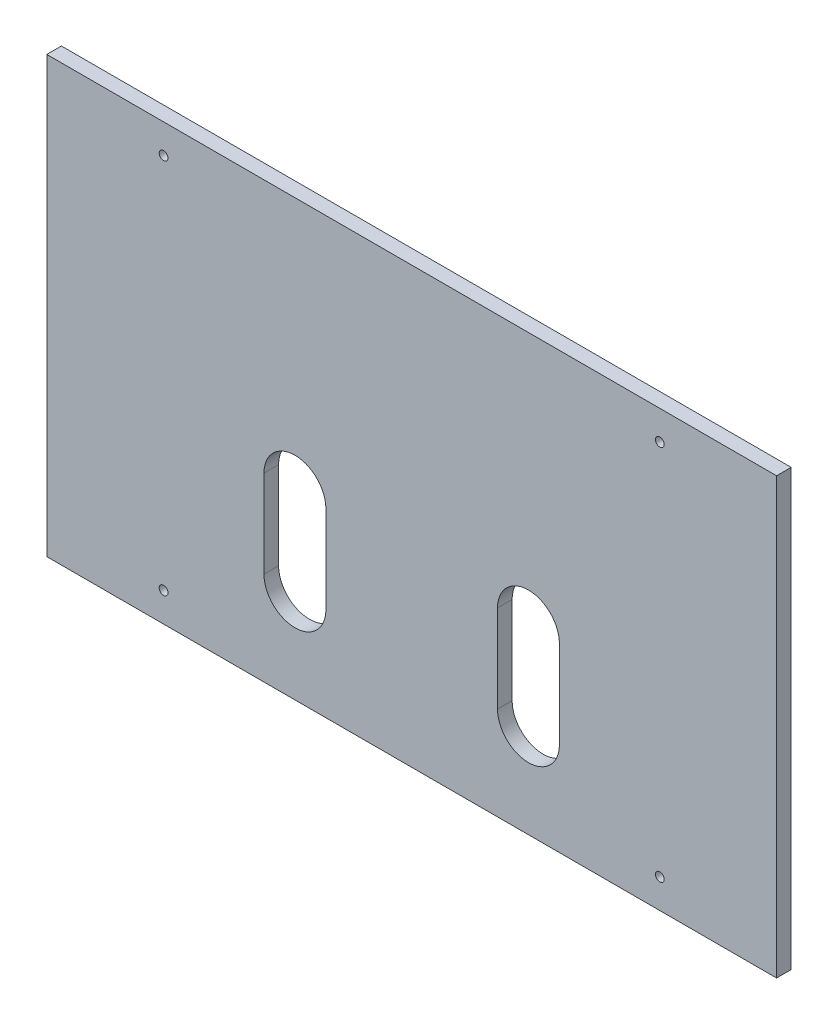
ISO-10303-21;
HEADER;
FILE_DESCRIPTION(('STEP AP214'),'2;1');
FILE_NAME('part.step','',(''),(''),'','','');
FILE_SCHEMA(('AUTOMOTIVE_DESIGN { 1 0 10303 214 1 1 1 1 }'));
ENDSEC;
DATA;
#1=APPLICATION_CONTEXT('core data for automotive mechanical design processes');
#2=APPLICATION_PROTOCOL_DEFINITION('international standard','automotive_design',2000,#1);
#3=PRODUCT_CONTEXT('',#1,'mechanical');
#4=PRODUCT('Part','Part','',(#3));
#5=PRODUCT_RELATED_PRODUCT_CATEGORY('part','',(#4));
#6=PRODUCT_DEFINITION_FORMATION('','',#4);
#7=PRODUCT_DEFINITION_CONTEXT('part definition',#1,'design');
#8=PRODUCT_DEFINITION('design','',#6,#7);
#9=PRODUCT_DEFINITION_SHAPE('','',#8);
#10=(LENGTH_UNIT() NAMED_UNIT(*) SI_UNIT(.MILLI.,.METRE.));
#11=(NAMED_UNIT(*) PLANE_ANGLE_UNIT() SI_UNIT($,.RADIAN.));
#12=(NAMED_UNIT(*) SI_UNIT($,.STERADIAN.) SOLID_ANGLE_UNIT());
#13=UNCERTAINTY_MEASURE_WITH_UNIT(LENGTH_MEASURE(1.E-05),#10,'distance_accuracy_value','');
#14=(GEOMETRIC_REPRESENTATION_CONTEXT(3) GLOBAL_UNCERTAINTY_ASSIGNED_CONTEXT((#13)) GLOBAL_UNIT_ASSIGNED_CONTEXT((#10,
#11,#12)) REPRESENTATION_CONTEXT('',''));
#15=CARTESIAN_POINT('',(0.,0.,0.));
#16=DIRECTION('',(0.,0.,1.));
#17=DIRECTION('',(1.,0.,0.));
#18=AXIS2_PLACEMENT_3D('',#15,#16,#17);
#19=CARTESIAN_POINT('',(125.,74.5,5.));
#20=DIRECTION('',(-1.,0.,0.));
#21=DIRECTION('',(0.,-1.,0.));
#22=AXIS2_PLACEMENT_3D('',#19,#20,#21);
#23=PLANE('',#22);
#24=DIRECTION('',(0.,1.,0.));
#25=VECTOR('',#24,1.);
#26=CARTESIAN_POINT('',(125.,74.5,0.));
#27=LINE('',#26,#25);
#28=CARTESIAN_POINT('',(125.,-74.5,0.));
#29=VERTEX_POINT('',#28);
#30=CARTESIAN_POINT('',(125.,74.5,0.));
#31=VERTEX_POINT('',#30);
#32=EDGE_CURVE('E260',#29,#31,#27,.T.);
#33=ORIENTED_EDGE('',*,*,#32,.T.);
#34=DIRECTION('',(0.,0.,-1.));
#35=VECTOR('',#34,1.);
#36=CARTESIAN_POINT('',(125.,74.5,5.));
#37=LINE('',#36,#35);
#38=CARTESIAN_POINT('',(125.,74.5,5.));
#39=VERTEX_POINT('',#38);
#40=EDGE_CURVE('E12',#39,#31,#37,.T.);
#41=ORIENTED_EDGE('',*,*,#40,.F.);
#42=DIRECTION('',(0.,1.,0.));
#43=VECTOR('',#42,1.);
#44=CARTESIAN_POINT('',(125.,74.5,5.));
#45=LINE('',#44,#43);
#46=CARTESIAN_POINT('',(125.,-74.5,5.));
#47=VERTEX_POINT('',#46);
#48=EDGE_CURVE('E242',#47,#39,#45,.T.);
#49=ORIENTED_EDGE('',*,*,#48,.F.);
#50=DIRECTION('',(0.,0.,-1.));
#51=VECTOR('',#50,1.);
#52=CARTESIAN_POINT('',(125.,-74.5,5.));
#53=LINE('',#52,#51);
#54=EDGE_CURVE('E259',#47,#29,#53,.T.);
#55=ORIENTED_EDGE('',*,*,#54,.T.);
#56=EDGE_LOOP('',(#33,#41,#49,#55));
#57=FACE_BOUND('',#56,.T.);
#58=ADVANCED_FACE('F42',(#57),#23,.F.);
#59=CARTESIAN_POINT('',(-125.,74.5,5.));
#60=DIRECTION('',(0.,-1.,0.));
#61=DIRECTION('',(0.,0.,-1.));
#62=AXIS2_PLACEMENT_3D('',#59,#60,#61);
#63=PLANE('',#62);
#64=DIRECTION('',(-1.,0.,0.));
#65=VECTOR('',#64,1.);
#66=CARTESIAN_POINT('',(-125.,74.5,0.));
#67=LINE('',#66,#65);
#68=CARTESIAN_POINT('',(-125.,74.5,0.));
#69=VERTEX_POINT('',#68);
#70=EDGE_CURVE('E263',#31,#69,#67,.T.);
#71=ORIENTED_EDGE('',*,*,#70,.T.);
#72=DIRECTION('',(0.,0.,-1.));
#73=VECTOR('',#72,1.);
#74=CARTESIAN_POINT('',(-125.,74.5,5.));
#75=LINE('',#74,#73);
#76=CARTESIAN_POINT('',(-125.,74.5,5.));
#77=VERTEX_POINT('',#76);
#78=EDGE_CURVE('E49',#77,#69,#75,.T.);
#79=ORIENTED_EDGE('',*,*,#78,.F.);
#80=DIRECTION('',(-1.,0.,0.));
#81=VECTOR('',#80,1.);
#82=CARTESIAN_POINT('',(-125.,74.5,5.));
#83=LINE('',#82,#81);
#84=EDGE_CURVE('E247',#39,#77,#83,.T.);
#85=ORIENTED_EDGE('',*,*,#84,.F.);
#86=ORIENTED_EDGE('',*,*,#40,.T.);
#87=EDGE_LOOP('',(#71,#79,#85,#86));
#88=FACE_BOUND('',#87,.T.);
#89=ADVANCED_FACE('F292',(#88),#63,.F.);
#90=CARTESIAN_POINT('',(-125.,74.5,5.));
#91=DIRECTION('',(1.,0.,0.));
#92=DIRECTION('',(0.,1.,0.));
#93=AXIS2_PLACEMENT_3D('',#90,#91,#92);
#94=PLANE('',#93);
#95=DIRECTION('',(0.,-1.,0.));
#96=VECTOR('',#95,1.);
#97=CARTESIAN_POINT('',(-125.,74.5,0.));
#98=LINE('',#97,#96);
#99=CARTESIAN_POINT('',(-125.,-74.5,0.));
#100=VERTEX_POINT('',#99);
#101=EDGE_CURVE('E265',#69,#100,#98,.T.);
#102=ORIENTED_EDGE('',*,*,#101,.T.);
#103=DIRECTION('',(0.,0.,-1.));
#104=VECTOR('',#103,1.);
#105=CARTESIAN_POINT('',(-125.,-74.5,5.));
#106=LINE('',#105,#104);
#107=CARTESIAN_POINT('',(-125.,-74.5,5.));
#108=VERTEX_POINT('',#107);
#109=EDGE_CURVE('E270',#108,#100,#106,.T.);
#110=ORIENTED_EDGE('',*,*,#109,.F.);
#111=DIRECTION('',(0.,-1.,0.));
#112=VECTOR('',#111,1.);
#113=CARTESIAN_POINT('',(-125.,74.5,5.));
#114=LINE('',#113,#112);
#115=EDGE_CURVE('E252',#77,#108,#114,.T.);
#116=ORIENTED_EDGE('',*,*,#115,.F.);
#117=ORIENTED_EDGE('',*,*,#78,.T.);
#118=EDGE_LOOP('',(#102,#110,#116,#117));
#119=FACE_BOUND('',#118,.T.);
#120=ADVANCED_FACE('F277',(#119),#94,.F.);
#121=CARTESIAN_POINT('',(-125.,-74.5,5.));
#122=DIRECTION('',(0.,1.,0.));
#123=DIRECTION('',(0.,0.,1.));
#124=AXIS2_PLACEMENT_3D('',#121,#122,#123);
#125=PLANE('',#124);
#126=DIRECTION('',(1.,0.,0.));
#127=VECTOR('',#126,1.);
#128=CARTESIAN_POINT('',(-125.,-74.5,0.));
#129=LINE('',#128,#127);
#130=EDGE_CURVE('E248',#100,#29,#129,.T.);
#131=ORIENTED_EDGE('',*,*,#130,.T.);
#132=ORIENTED_EDGE('',*,*,#54,.F.);
#133=DIRECTION('',(1.,0.,0.));
#134=VECTOR('',#133,1.);
#135=CARTESIAN_POINT('',(-125.,-74.5,5.));
#136=LINE('',#135,#134);
#137=EDGE_CURVE('E255',#108,#47,#136,.T.);
#138=ORIENTED_EDGE('',*,*,#137,.F.);
#139=ORIENTED_EDGE('',*,*,#109,.T.);
#140=EDGE_LOOP('',(#131,#132,#138,#139));
#141=FACE_BOUND('',#140,.T.);
#142=ADVANCED_FACE('F285',(#141),#125,.F.);
#143=CARTESIAN_POINT('',(0.,0.,5.));
#144=DIRECTION('',(0.,0.,1.));
#145=DIRECTION('',(1.,0.,0.));
#146=AXIS2_PLACEMENT_3D('',#143,#144,#145);
#147=PLANE('',#146);
#148=CARTESIAN_POINT('',(-40.,-12.5,5.));
#149=DIRECTION('',(0.,0.,1.));
#150=DIRECTION('',(1.,0.,0.));
#151=AXIS2_PLACEMENT_3D('',#148,#149,#150);
#152=CIRCLE('',#151,10.6);
#153=CARTESIAN_POINT('',(-29.4,-12.5,5.));
#154=VERTEX_POINT('',#153);
#155=CARTESIAN_POINT('',(-50.6,-12.5,5.));
#156=VERTEX_POINT('',#155);
#157=EDGE_CURVE('E56',#154,#156,#152,.T.);
#158=ORIENTED_EDGE('',*,*,#157,.F.);
#159=DIRECTION('',(0.,1.,0.));
#160=VECTOR('',#159,1.);
#161=CARTESIAN_POINT('',(-29.4,-12.5,5.));
#162=LINE('',#161,#160);
#163=CARTESIAN_POINT('',(-29.4,-42.5,5.));
#164=VERTEX_POINT('',#163);
#165=EDGE_CURVE('E151',#164,#154,#162,.T.);
#166=ORIENTED_EDGE('',*,*,#165,.F.);
#167=CARTESIAN_POINT('',(-40.,-42.5,5.));
#168=DIRECTION('',(0.,0.,1.));
#169=DIRECTION('',(1.,0.,0.));
#170=AXIS2_PLACEMENT_3D('',#167,#168,#169);
#171=CIRCLE('',#170,10.6);
#172=CARTESIAN_POINT('',(-50.6,-42.5,5.));
#173=VERTEX_POINT('',#172);
#174=EDGE_CURVE('E155',#173,#164,#171,.T.);
#175=ORIENTED_EDGE('',*,*,#174,.F.);
#176=DIRECTION('',(0.,-1.,0.));
#177=VECTOR('',#176,1.);
#178=CARTESIAN_POINT('',(-50.6,-12.5,5.));
#179=LINE('',#178,#177);
#180=EDGE_CURVE('E163',#156,#173,#179,.T.);
#181=ORIENTED_EDGE('',*,*,#180,.F.);
#182=EDGE_LOOP('',(#158,#166,#175,#181));
#183=FACE_BOUND('',#182,.T.);
#184=CARTESIAN_POINT('',(40.,-12.5,5.));
#185=DIRECTION('',(0.,0.,1.));
#186=DIRECTION('',(-1.,0.,0.));
#187=AXIS2_PLACEMENT_3D('',#184,#185,#186);
#188=CIRCLE('',#187,10.6);
#189=CARTESIAN_POINT('',(50.6,-12.5,5.));
#190=VERTEX_POINT('',#189);
#191=CARTESIAN_POINT('',(29.4,-12.5,5.));
#192=VERTEX_POINT('',#191);
#193=EDGE_CURVE('E64',#190,#192,#188,.T.);
#194=ORIENTED_EDGE('',*,*,#193,.F.);
#195=DIRECTION('',(0.,1.,0.));
#196=VECTOR('',#195,1.);
#197=CARTESIAN_POINT('',(50.6,-12.5,5.));
#198=LINE('',#197,#196);
#199=CARTESIAN_POINT('',(50.6,-42.5,5.));
#200=VERTEX_POINT('',#199);
#201=EDGE_CURVE('E188',#200,#190,#198,.T.);
#202=ORIENTED_EDGE('',*,*,#201,.F.);
#203=CARTESIAN_POINT('',(40.,-42.5,5.));
#204=DIRECTION('',(0.,0.,1.));
#205=DIRECTION('',(-1.,0.,0.));
#206=AXIS2_PLACEMENT_3D('',#203,#204,#205);
#207=CIRCLE('',#206,10.6);
#208=CARTESIAN_POINT('',(29.4,-42.5,5.));
#209=VERTEX_POINT('',#208);
#210=EDGE_CURVE('E193',#209,#200,#207,.T.);
#211=ORIENTED_EDGE('',*,*,#210,.F.);
#212=DIRECTION('',(0.,-1.,0.));
#213=VECTOR('',#212,1.);
#214=CARTESIAN_POINT('',(29.4,-12.5,5.));
#215=LINE('',#214,#213);
#216=EDGE_CURVE('E205',#192,#209,#215,.T.);
#217=ORIENTED_EDGE('',*,*,#216,.F.);
#218=EDGE_LOOP('',(#194,#202,#211,#217));
#219=FACE_BOUND('',#218,.T.);
#220=CARTESIAN_POINT('',(85.,64.5,5.));
#221=DIRECTION('',(0.,0.,1.));
#222=DIRECTION('',(-1.,0.,0.));
#223=AXIS2_PLACEMENT_3D('',#220,#221,#222);
#224=CIRCLE('',#223,1.5);
#225=CARTESIAN_POINT('',(83.5,64.5,5.));
#226=VERTEX_POINT('',#225);
#227=EDGE_CURVE('E360',#226,#226,#224,.T.);
#228=ORIENTED_EDGE('',*,*,#227,.F.);
#229=EDGE_LOOP('',(#228));
#230=FACE_BOUND('',#229,.T.);
#231=CARTESIAN_POINT('',(85.,-64.5,5.));
#232=DIRECTION('',(0.,0.,1.));
#233=DIRECTION('',(1.,0.,0.));
#234=AXIS2_PLACEMENT_3D('',#231,#232,#233);
#235=CIRCLE('',#234,1.5);
#236=CARTESIAN_POINT('',(86.5,-64.5,5.));
#237=VERTEX_POINT('',#236);
#238=EDGE_CURVE('E364',#237,#237,#235,.T.);
#239=ORIENTED_EDGE('',*,*,#238,.F.);
#240=EDGE_LOOP('',(#239));
#241=FACE_BOUND('',#240,.T.);
#242=CARTESIAN_POINT('',(-85.,-64.5,5.));
#243=DIRECTION('',(0.,0.,1.));
#244=DIRECTION('',(-1.,0.,0.));
#245=AXIS2_PLACEMENT_3D('',#242,#243,#244);
#246=CIRCLE('',#245,1.5);
#247=CARTESIAN_POINT('',(-86.5,-64.5,5.));
#248=VERTEX_POINT('',#247);
#249=EDGE_CURVE('E222',#248,#248,#246,.T.);
#250=ORIENTED_EDGE('',*,*,#249,.F.);
#251=EDGE_LOOP('',(#250));
#252=FACE_BOUND('',#251,.T.);
#253=CARTESIAN_POINT('',(-85.,64.5,5.));
#254=DIRECTION('',(0.,0.,1.));
#255=DIRECTION('',(1.,0.,0.));
#256=AXIS2_PLACEMENT_3D('',#253,#254,#255);
#257=CIRCLE('',#256,1.5);
#258=CARTESIAN_POINT('',(-83.5,64.5,5.));
#259=VERTEX_POINT('',#258);
#260=EDGE_CURVE('E227',#259,#259,#257,.T.);
#261=ORIENTED_EDGE('',*,*,#260,.F.);
#262=EDGE_LOOP('',(#261));
#263=FACE_BOUND('',#262,.T.);
#264=ORIENTED_EDGE('',*,*,#48,.T.);
#265=ORIENTED_EDGE('',*,*,#84,.T.);
#266=ORIENTED_EDGE('',*,*,#115,.T.);
#267=ORIENTED_EDGE('',*,*,#137,.T.);
#268=EDGE_LOOP('',(#264,#265,#266,#267));
#269=FACE_BOUND('',#268,.T.);
#270=ADVANCED_FACE('F291',(#183,#219,#230,#241,#252,#263,#269),#147,.T.);
#271=CARTESIAN_POINT('',(0.,0.,0.));
#272=DIRECTION('',(0.,0.,1.));
#273=DIRECTION('',(1.,0.,0.));
#274=AXIS2_PLACEMENT_3D('',#271,#272,#273);
#275=PLANE('',#274);
#276=DIRECTION('',(0.,1.,0.));
#277=VECTOR('',#276,1.);
#278=CARTESIAN_POINT('',(-29.4,-12.5,0.));
#279=LINE('',#278,#277);
#280=CARTESIAN_POINT('',(-29.4,-42.5,0.));
#281=VERTEX_POINT('',#280);
#282=CARTESIAN_POINT('',(-29.4,-12.5,0.));
#283=VERTEX_POINT('',#282);
#284=EDGE_CURVE('E138',#281,#283,#279,.T.);
#285=ORIENTED_EDGE('',*,*,#284,.T.);
#286=CARTESIAN_POINT('',(-40.,-12.5,0.));
#287=DIRECTION('',(0.,0.,1.));
#288=DIRECTION('',(1.,0.,0.));
#289=AXIS2_PLACEMENT_3D('',#286,#287,#288);
#290=CIRCLE('',#289,10.6);
#291=CARTESIAN_POINT('',(-50.6,-12.5,0.));
#292=VERTEX_POINT('',#291);
#293=EDGE_CURVE('E132',#283,#292,#290,.T.);
#294=ORIENTED_EDGE('',*,*,#293,.T.);
#295=DIRECTION('',(0.,-1.,0.));
#296=VECTOR('',#295,1.);
#297=CARTESIAN_POINT('',(-50.6,-12.5,0.));
#298=LINE('',#297,#296);
#299=CARTESIAN_POINT('',(-50.6,-42.5,0.));
#300=VERTEX_POINT('',#299);
#301=EDGE_CURVE('E142',#292,#300,#298,.T.);
#302=ORIENTED_EDGE('',*,*,#301,.T.);
#303=CARTESIAN_POINT('',(-40.,-42.5,0.));
#304=DIRECTION('',(0.,0.,1.));
#305=DIRECTION('',(1.,0.,0.));
#306=AXIS2_PLACEMENT_3D('',#303,#304,#305);
#307=CIRCLE('',#306,10.6);
#308=EDGE_CURVE('E146',#300,#281,#307,.T.);
#309=ORIENTED_EDGE('',*,*,#308,.T.);
#310=EDGE_LOOP('',(#285,#294,#302,#309));
#311=FACE_BOUND('',#310,.T.);
#312=DIRECTION('',(0.,1.,0.));
#313=VECTOR('',#312,1.);
#314=CARTESIAN_POINT('',(50.6,-12.5,0.));
#315=LINE('',#314,#313);
#316=CARTESIAN_POINT('',(50.6,-42.5,0.));
#317=VERTEX_POINT('',#316);
#318=CARTESIAN_POINT('',(50.6,-12.5,0.));
#319=VERTEX_POINT('',#318);
#320=EDGE_CURVE('E181',#317,#319,#315,.T.);
#321=ORIENTED_EDGE('',*,*,#320,.T.);
#322=CARTESIAN_POINT('',(40.,-12.5,0.));
#323=DIRECTION('',(0.,0.,1.));
#324=DIRECTION('',(-1.,0.,0.));
#325=AXIS2_PLACEMENT_3D('',#322,#323,#324);
#326=CIRCLE('',#325,10.6);
#327=CARTESIAN_POINT('',(29.4,-12.5,0.));
#328=VERTEX_POINT('',#327);
#329=EDGE_CURVE('E194',#319,#328,#326,.T.);
#330=ORIENTED_EDGE('',*,*,#329,.T.);
#331=DIRECTION('',(0.,-1.,0.));
#332=VECTOR('',#331,1.);
#333=CARTESIAN_POINT('',(29.4,-12.5,0.));
#334=LINE('',#333,#332);
#335=CARTESIAN_POINT('',(29.4,-42.5,0.));
#336=VERTEX_POINT('',#335);
#337=EDGE_CURVE('E217',#328,#336,#334,.T.);
#338=ORIENTED_EDGE('',*,*,#337,.T.);
#339=CARTESIAN_POINT('',(40.,-42.5,0.));
#340=DIRECTION('',(0.,0.,1.));
#341=DIRECTION('',(-1.,0.,0.));
#342=AXIS2_PLACEMENT_3D('',#339,#340,#341);
#343=CIRCLE('',#342,10.6);
#344=EDGE_CURVE('E214',#336,#317,#343,.T.);
#345=ORIENTED_EDGE('',*,*,#344,.T.);
#346=EDGE_LOOP('',(#321,#330,#338,#345));
#347=FACE_BOUND('',#346,.T.);
#348=CARTESIAN_POINT('',(85.,64.5,0.));
#349=DIRECTION('',(0.,0.,1.));
#350=DIRECTION('',(-1.,0.,0.));
#351=AXIS2_PLACEMENT_3D('',#348,#349,#350);
#352=CIRCLE('',#351,1.5);
#353=CARTESIAN_POINT('',(83.5,64.5,0.));
#354=VERTEX_POINT('',#353);
#355=EDGE_CURVE('E175',#354,#354,#352,.T.);
#356=ORIENTED_EDGE('',*,*,#355,.T.);
#357=EDGE_LOOP('',(#356));
#358=FACE_BOUND('',#357,.T.);
#359=CARTESIAN_POINT('',(85.,-64.5,0.));
#360=DIRECTION('',(0.,0.,1.));
#361=DIRECTION('',(1.,0.,0.));
#362=AXIS2_PLACEMENT_3D('',#359,#360,#361);
#363=CIRCLE('',#362,1.5);
#364=CARTESIAN_POINT('',(86.5,-64.5,0.));
#365=VERTEX_POINT('',#364);
#366=EDGE_CURVE('E363',#365,#365,#363,.T.);
#367=ORIENTED_EDGE('',*,*,#366,.T.);
#368=EDGE_LOOP('',(#367));
#369=FACE_BOUND('',#368,.T.);
#370=CARTESIAN_POINT('',(-85.,-64.5,0.));
#371=DIRECTION('',(0.,0.,1.));
#372=DIRECTION('',(-1.,0.,0.));
#373=AXIS2_PLACEMENT_3D('',#370,#371,#372);
#374=CIRCLE('',#373,1.5);
#375=CARTESIAN_POINT('',(-86.5,-64.5,0.));
#376=VERTEX_POINT('',#375);
#377=EDGE_CURVE('E228',#376,#376,#374,.T.);
#378=ORIENTED_EDGE('',*,*,#377,.T.);
#379=EDGE_LOOP('',(#378));
#380=FACE_BOUND('',#379,.T.);
#381=CARTESIAN_POINT('',(-85.,64.5,0.));
#382=DIRECTION('',(0.,0.,1.));
#383=DIRECTION('',(1.,0.,0.));
#384=AXIS2_PLACEMENT_3D('',#381,#382,#383);
#385=CIRCLE('',#384,1.5);
#386=CARTESIAN_POINT('',(-83.5,64.5,0.));
#387=VERTEX_POINT('',#386);
#388=EDGE_CURVE('E240',#387,#387,#385,.T.);
#389=ORIENTED_EDGE('',*,*,#388,.T.);
#390=EDGE_LOOP('',(#389));
#391=FACE_BOUND('',#390,.T.);
#392=ORIENTED_EDGE('',*,*,#32,.F.);
#393=ORIENTED_EDGE('',*,*,#130,.F.);
#394=ORIENTED_EDGE('',*,*,#101,.F.);
#395=ORIENTED_EDGE('',*,*,#70,.F.);
#396=EDGE_LOOP('',(#392,#393,#394,#395));
#397=FACE_BOUND('',#396,.T.);
#398=ADVANCED_FACE('F148',(#311,#347,#358,#369,#380,#391,#397),#275,.F.);
#399=CARTESIAN_POINT('',(-85.,64.5,0.));
#400=DIRECTION('',(0.,0.,1.));
#401=DIRECTION('',(1.,0.,0.));
#402=AXIS2_PLACEMENT_3D('',#399,#400,#401);
#403=CYLINDRICAL_SURFACE('',#402,1.5);
#404=ORIENTED_EDGE('',*,*,#388,.F.);
#405=EDGE_LOOP('',(#404));
#406=FACE_BOUND('',#405,.T.);
#407=ORIENTED_EDGE('',*,*,#260,.T.);
#408=EDGE_LOOP('',(#407));
#409=FACE_BOUND('',#408,.T.);
#410=ADVANCED_FACE('F304',(#406,#409),#403,.F.);
#411=CARTESIAN_POINT('',(-85.,-64.5,0.));
#412=DIRECTION('',(0.,0.,1.));
#413=DIRECTION('',(1.,0.,0.));
#414=AXIS2_PLACEMENT_3D('',#411,#412,#413);
#415=CYLINDRICAL_SURFACE('',#414,1.5);
#416=ORIENTED_EDGE('',*,*,#377,.F.);
#417=EDGE_LOOP('',(#416));
#418=FACE_BOUND('',#417,.T.);
#419=ORIENTED_EDGE('',*,*,#249,.T.);
#420=EDGE_LOOP('',(#419));
#421=FACE_BOUND('',#420,.T.);
#422=ADVANCED_FACE('F310',(#418,#421),#415,.F.);
#423=CARTESIAN_POINT('',(85.,-64.5,0.));
#424=DIRECTION('',(0.,0.,1.));
#425=DIRECTION('',(1.,0.,0.));
#426=AXIS2_PLACEMENT_3D('',#423,#424,#425);
#427=CYLINDRICAL_SURFACE('',#426,1.5);
#428=ORIENTED_EDGE('',*,*,#366,.F.);
#429=EDGE_LOOP('',(#428));
#430=FACE_BOUND('',#429,.T.);
#431=ORIENTED_EDGE('',*,*,#238,.T.);
#432=EDGE_LOOP('',(#431));
#433=FACE_BOUND('',#432,.T.);
#434=ADVANCED_FACE('F316',(#430,#433),#427,.F.);
#435=CARTESIAN_POINT('',(85.,64.5,0.));
#436=DIRECTION('',(0.,0.,1.));
#437=DIRECTION('',(1.,0.,0.));
#438=AXIS2_PLACEMENT_3D('',#435,#436,#437);
#439=CYLINDRICAL_SURFACE('',#438,1.5);
#440=ORIENTED_EDGE('',*,*,#355,.F.);
#441=EDGE_LOOP('',(#440));
#442=FACE_BOUND('',#441,.T.);
#443=ORIENTED_EDGE('',*,*,#227,.T.);
#444=EDGE_LOOP('',(#443));
#445=FACE_BOUND('',#444,.T.);
#446=ADVANCED_FACE('F312',(#442,#445),#439,.F.);
#447=CARTESIAN_POINT('',(40.,-12.5,0.));
#448=DIRECTION('',(0.,0.,1.));
#449=DIRECTION('',(1.,0.,0.));
#450=AXIS2_PLACEMENT_3D('',#447,#448,#449);
#451=CYLINDRICAL_SURFACE('',#450,10.6);
#452=ORIENTED_EDGE('',*,*,#193,.T.);
#453=DIRECTION('',(0.,0.,1.));
#454=VECTOR('',#453,1.);
#455=CARTESIAN_POINT('',(29.4,-12.5,0.));
#456=LINE('',#455,#454);
#457=EDGE_CURVE('E179',#328,#192,#456,.T.);
#458=ORIENTED_EDGE('',*,*,#457,.F.);
#459=ORIENTED_EDGE('',*,*,#329,.F.);
#460=DIRECTION('',(0.,0.,1.));
#461=VECTOR('',#460,1.);
#462=CARTESIAN_POINT('',(50.6,-12.5,0.));
#463=LINE('',#462,#461);
#464=EDGE_CURVE('E186',#319,#190,#463,.T.);
#465=ORIENTED_EDGE('',*,*,#464,.T.);
#466=EDGE_LOOP('',(#452,#458,#459,#465));
#467=FACE_BOUND('',#466,.T.);
#468=ADVANCED_FACE('F315',(#467),#451,.F.);
#469=CARTESIAN_POINT('',(50.6,-12.5,0.));
#470=DIRECTION('',(1.,0.,0.));
#471=DIRECTION('',(0.,1.,0.));
#472=AXIS2_PLACEMENT_3D('',#469,#470,#471);
#473=PLANE('',#472);
#474=ORIENTED_EDGE('',*,*,#201,.T.);
#475=ORIENTED_EDGE('',*,*,#464,.F.);
#476=ORIENTED_EDGE('',*,*,#320,.F.);
#477=DIRECTION('',(0.,0.,1.));
#478=VECTOR('',#477,1.);
#479=CARTESIAN_POINT('',(50.6,-42.5,0.));
#480=LINE('',#479,#478);
#481=EDGE_CURVE('E184',#317,#200,#480,.T.);
#482=ORIENTED_EDGE('',*,*,#481,.T.);
#483=EDGE_LOOP('',(#474,#475,#476,#482));
#484=FACE_BOUND('',#483,.T.);
#485=ADVANCED_FACE('F324',(#484),#473,.F.);
#486=CARTESIAN_POINT('',(40.,-42.5,0.));
#487=DIRECTION('',(0.,0.,1.));
#488=DIRECTION('',(1.,0.,0.));
#489=AXIS2_PLACEMENT_3D('',#486,#487,#488);
#490=CYLINDRICAL_SURFACE('',#489,10.6);
#491=ORIENTED_EDGE('',*,*,#210,.T.);
#492=ORIENTED_EDGE('',*,*,#481,.F.);
#493=ORIENTED_EDGE('',*,*,#344,.F.);
#494=DIRECTION('',(0.,0.,1.));
#495=VECTOR('',#494,1.);
#496=CARTESIAN_POINT('',(29.4,-42.5,0.));
#497=LINE('',#496,#495);
#498=EDGE_CURVE('E182',#336,#209,#497,.T.);
#499=ORIENTED_EDGE('',*,*,#498,.T.);
#500=EDGE_LOOP('',(#491,#492,#493,#499));
#501=FACE_BOUND('',#500,.T.);
#502=ADVANCED_FACE('F327',(#501),#490,.F.);
#503=CARTESIAN_POINT('',(29.4,-12.5,0.));
#504=DIRECTION('',(-1.,0.,0.));
#505=DIRECTION('',(0.,-1.,0.));
#506=AXIS2_PLACEMENT_3D('',#503,#504,#505);
#507=PLANE('',#506);
#508=ORIENTED_EDGE('',*,*,#216,.T.);
#509=ORIENTED_EDGE('',*,*,#498,.F.);
#510=ORIENTED_EDGE('',*,*,#337,.F.);
#511=ORIENTED_EDGE('',*,*,#457,.T.);
#512=EDGE_LOOP('',(#508,#509,#510,#511));
#513=FACE_BOUND('',#512,.T.);
#514=ADVANCED_FACE('F331',(#513),#507,.F.);
#515=CARTESIAN_POINT('',(-40.,-12.5,0.));
#516=DIRECTION('',(0.,0.,1.));
#517=DIRECTION('',(1.,0.,0.));
#518=AXIS2_PLACEMENT_3D('',#515,#516,#517);
#519=CYLINDRICAL_SURFACE('',#518,10.6);
#520=ORIENTED_EDGE('',*,*,#157,.T.);
#521=DIRECTION('',(0.,0.,1.));
#522=VECTOR('',#521,1.);
#523=CARTESIAN_POINT('',(-50.6,-12.5,0.));
#524=LINE('',#523,#522);
#525=EDGE_CURVE('E128',#292,#156,#524,.T.);
#526=ORIENTED_EDGE('',*,*,#525,.F.);
#527=ORIENTED_EDGE('',*,*,#293,.F.);
#528=DIRECTION('',(0.,0.,1.));
#529=VECTOR('',#528,1.);
#530=CARTESIAN_POINT('',(-29.4,-12.5,0.));
#531=LINE('',#530,#529);
#532=EDGE_CURVE('E173',#283,#154,#531,.T.);
#533=ORIENTED_EDGE('',*,*,#532,.T.);
#534=EDGE_LOOP('',(#520,#526,#527,#533));
#535=FACE_BOUND('',#534,.T.);
#536=ADVANCED_FACE('F130',(#535),#519,.F.);
#537=CARTESIAN_POINT('',(-29.4,-12.5,0.));
#538=DIRECTION('',(1.,0.,0.));
#539=DIRECTION('',(0.,1.,0.));
#540=AXIS2_PLACEMENT_3D('',#537,#538,#539);
#541=PLANE('',#540);
#542=ORIENTED_EDGE('',*,*,#165,.T.);
#543=ORIENTED_EDGE('',*,*,#532,.F.);
#544=ORIENTED_EDGE('',*,*,#284,.F.);
#545=DIRECTION('',(0.,0.,1.));
#546=VECTOR('',#545,1.);
#547=CARTESIAN_POINT('',(-29.4,-42.5,0.));
#548=LINE('',#547,#546);
#549=EDGE_CURVE('E176',#281,#164,#548,.T.);
#550=ORIENTED_EDGE('',*,*,#549,.T.);
#551=EDGE_LOOP('',(#542,#543,#544,#550));
#552=FACE_BOUND('',#551,.T.);
#553=ADVANCED_FACE('F340',(#552),#541,.F.);
#554=CARTESIAN_POINT('',(-40.,-42.5,0.));
#555=DIRECTION('',(0.,0.,1.));
#556=DIRECTION('',(1.,0.,0.));
#557=AXIS2_PLACEMENT_3D('',#554,#555,#556);
#558=CYLINDRICAL_SURFACE('',#557,10.6);
#559=ORIENTED_EDGE('',*,*,#174,.T.);
#560=ORIENTED_EDGE('',*,*,#549,.F.);
#561=ORIENTED_EDGE('',*,*,#308,.F.);
#562=DIRECTION('',(0.,0.,1.));
#563=VECTOR('',#562,1.);
#564=CARTESIAN_POINT('',(-50.6,-42.5,0.));
#565=LINE('',#564,#563);
#566=EDGE_CURVE('E137',#300,#173,#565,.T.);
#567=ORIENTED_EDGE('',*,*,#566,.T.);
#568=EDGE_LOOP('',(#559,#560,#561,#567));
#569=FACE_BOUND('',#568,.T.);
#570=ADVANCED_FACE('F343',(#569),#558,.F.);
#571=CARTESIAN_POINT('',(-50.6,-12.5,0.));
#572=DIRECTION('',(-1.,0.,0.));
#573=DIRECTION('',(0.,-1.,0.));
#574=AXIS2_PLACEMENT_3D('',#571,#572,#573);
#575=PLANE('',#574);
#576=ORIENTED_EDGE('',*,*,#180,.T.);
#577=ORIENTED_EDGE('',*,*,#566,.F.);
#578=ORIENTED_EDGE('',*,*,#301,.F.);
#579=ORIENTED_EDGE('',*,*,#525,.T.);
#580=EDGE_LOOP('',(#576,#577,#578,#579));
#581=FACE_BOUND('',#580,.T.);
#582=ADVANCED_FACE('F143',(#581),#575,.F.);
#583=CLOSED_SHELL('',(#58,#89,#120,#142,#270,#398,#410,#422,#434,#446,#468,#485,#502,#514,#536,
#553,#570,#582));
#584=MANIFOLD_SOLID_BREP('B2',#583);
#585=ADVANCED_BREP_SHAPE_REPRESENTATION('',(#18,#584),#14);
#586=SHAPE_DEFINITION_REPRESENTATION(#9,#585);
ENDSEC;
END-ISO-10303-21;
